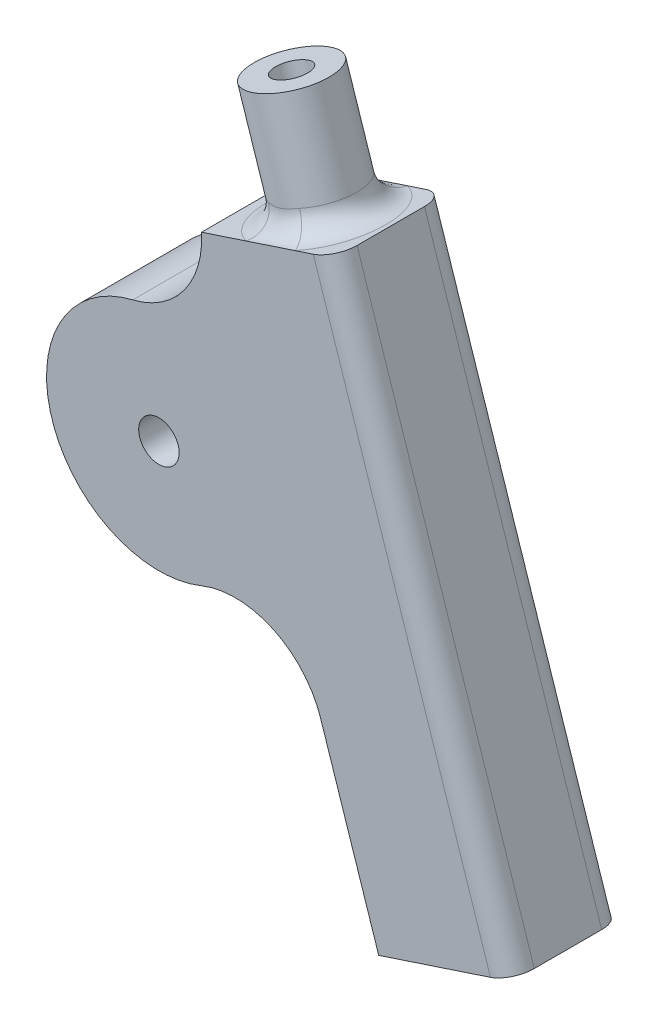
ISO-10303-21;
HEADER;
FILE_DESCRIPTION(('STEP AP214'),'2;1');
FILE_NAME('part.step','',(''),(''),'','','');
FILE_SCHEMA(('AUTOMOTIVE_DESIGN { 1 0 10303 214 1 1 1 1 }'));
ENDSEC;
DATA;
#1=APPLICATION_CONTEXT('core data for automotive mechanical design processes');
#2=APPLICATION_PROTOCOL_DEFINITION('international standard','automotive_design',2000,#1);
#3=PRODUCT_CONTEXT('',#1,'mechanical');
#4=PRODUCT('Part','Part','',(#3));
#5=PRODUCT_RELATED_PRODUCT_CATEGORY('part','',(#4));
#6=PRODUCT_DEFINITION_FORMATION('','',#4);
#7=PRODUCT_DEFINITION_CONTEXT('part definition',#1,'design');
#8=PRODUCT_DEFINITION('design','',#6,#7);
#9=PRODUCT_DEFINITION_SHAPE('','',#8);
#10=(LENGTH_UNIT() NAMED_UNIT(*) SI_UNIT(.MILLI.,.METRE.));
#11=(NAMED_UNIT(*) PLANE_ANGLE_UNIT() SI_UNIT($,.RADIAN.));
#12=(NAMED_UNIT(*) SI_UNIT($,.STERADIAN.) SOLID_ANGLE_UNIT());
#13=UNCERTAINTY_MEASURE_WITH_UNIT(LENGTH_MEASURE(1.E-05),#10,'distance_accuracy_value','');
#14=(GEOMETRIC_REPRESENTATION_CONTEXT(3) GLOBAL_UNCERTAINTY_ASSIGNED_CONTEXT((#13)) GLOBAL_UNIT_ASSIGNED_CONTEXT((#10,
#11,#12)) REPRESENTATION_CONTEXT('',''));
#15=CARTESIAN_POINT('',(0.,0.,0.));
#16=DIRECTION('',(0.,0.,1.));
#17=DIRECTION('',(1.,0.,0.));
#18=AXIS2_PLACEMENT_3D('',#15,#16,#17);
#19=CARTESIAN_POINT('',(1.89625987948407,14.0501920467847,-2.49999999999998));
#20=DIRECTION('',(-0.312988116167319,0.949757042162906,0.));
#21=DIRECTION('',(-0.949757042162906,-0.312988116167319,0.));
#22=AXIS2_PLACEMENT_3D('',#19,#20,#21);
#23=PLANE('',#22);
#24=DIRECTION('',(0.,0.,1.));
#25=VECTOR('',#24,1.);
#26=CARTESIAN_POINT('',(7.81875317482997,16.0019227918418,-2.49999999999998));
#27=LINE('',#26,#25);
#28=CARTESIAN_POINT('',(7.81875317482997,16.0019227918418,-1.50000000000002));
#29=VERTEX_POINT('',#28);
#30=CARTESIAN_POINT('',(7.81875317482997,16.0019227918418,1.50000000000002));
#31=VERTEX_POINT('',#30);
#32=EDGE_CURVE('E172',#29,#31,#27,.T.);
#33=ORIENTED_EDGE('',*,*,#32,.F.);
#34=CARTESIAN_POINT('',(6.86899613266706,15.6889346756745,-1.50000000000002));
#35=DIRECTION('',(-0.312988116167319,0.949757042162906,0.));
#36=DIRECTION('',(-0.949757042162906,-0.312988116167319,0.));
#37=AXIS2_PLACEMENT_3D('',#34,#35,#36);
#38=CIRCLE('',#37,1.);
#39=CARTESIAN_POINT('',(6.86899613266706,15.6889346756745,-2.49999999999998));
#40=VERTEX_POINT('',#39);
#41=EDGE_CURVE('E375',#29,#40,#38,.T.);
#42=ORIENTED_EDGE('',*,*,#41,.T.);
#43=DIRECTION('',(-0.949757042162906,-0.312988116167319,0.));
#44=VECTOR('',#43,1.);
#45=CARTESIAN_POINT('',(1.89625987948407,14.0501920467847,-2.49999999999998));
#46=LINE('',#45,#44);
#47=CARTESIAN_POINT('',(6.05766944729259,15.4215656543579,-2.49999999999998));
#48=VERTEX_POINT('',#47);
#49=EDGE_CURVE('E168',#40,#48,#46,.T.);
#50=ORIENTED_EDGE('',*,*,#49,.T.);
#51=CARTESIAN_POINT('',(4.96958606291033,15.0629927208683,0.));
#52=DIRECTION('',(-0.312988116167319,0.949757042162906,0.));
#53=DIRECTION('',(-0.949757042162906,-0.312988116167319,0.));
#54=AXIS2_PLACEMENT_3D('',#51,#52,#53);
#55=CIRCLE('',#54,2.75);
#56=CARTESIAN_POINT('',(6.05766944729252,15.4215656543579,2.50000000000002));
#57=VERTEX_POINT('',#56);
#58=EDGE_CURVE('E341',#48,#57,#55,.F.);
#59=ORIENTED_EDGE('',*,*,#58,.T.);
#60=DIRECTION('',(-0.949757042162906,-0.312988116167319,0.));
#61=VECTOR('',#60,1.);
#62=CARTESIAN_POINT('',(1.89625987948407,14.0501920467847,2.50000000000002));
#63=LINE('',#62,#61);
#64=CARTESIAN_POINT('',(6.86899613266706,15.6889346756745,2.50000000000002));
#65=VERTEX_POINT('',#64);
#66=EDGE_CURVE('E154',#65,#57,#63,.T.);
#67=ORIENTED_EDGE('',*,*,#66,.F.);
#68=CARTESIAN_POINT('',(6.86899613266706,15.6889346756745,1.50000000000002));
#69=DIRECTION('',(-0.312988116167319,0.949757042162906,0.));
#70=DIRECTION('',(-0.949757042162906,-0.312988116167319,0.));
#71=AXIS2_PLACEMENT_3D('',#68,#69,#70);
#72=CIRCLE('',#71,1.);
#73=EDGE_CURVE('E377',#65,#31,#72,.T.);
#74=ORIENTED_EDGE('',*,*,#73,.T.);
#75=EDGE_LOOP('',(#33,#42,#50,#59,#67,#74));
#76=FACE_BOUND('',#75,.T.);
#77=ADVANCED_FACE('F38',(#76),#23,.T.);
#78=CARTESIAN_POINT('',(3.88150267852815,14.7044197873788,2.50000000000002));
#79=VERTEX_POINT('',#78);
#80=CARTESIAN_POINT('',(1.89625987948407,14.0501920467847,2.50000000000002));
#81=VERTEX_POINT('',#80);
#82=EDGE_CURVE('E167',#79,#81,#63,.T.);
#83=ORIENTED_EDGE('',*,*,#82,.F.);
#84=CARTESIAN_POINT('',(4.96958606291033,15.0629927208683,0.));
#85=DIRECTION('',(-0.312988116167319,0.949757042162906,0.));
#86=DIRECTION('',(-0.949757042162906,-0.312988116167319,0.));
#87=AXIS2_PLACEMENT_3D('',#84,#85,#86);
#88=CIRCLE('',#87,2.75);
#89=CARTESIAN_POINT('',(3.88150267852808,14.7044197873787,-2.49999999999998));
#90=VERTEX_POINT('',#89);
#91=EDGE_CURVE('E328',#79,#90,#88,.F.);
#92=ORIENTED_EDGE('',*,*,#91,.T.);
#93=CARTESIAN_POINT('',(1.89625987948407,14.0501920467847,-2.49999999999998));
#94=VERTEX_POINT('',#93);
#95=EDGE_CURVE('E153',#90,#94,#46,.T.);
#96=ORIENTED_EDGE('',*,*,#95,.T.);
#97=DIRECTION('',(0.,0.,1.));
#98=VECTOR('',#97,1.);
#99=CARTESIAN_POINT('',(1.89625987948407,14.0501920467847,-2.49999999999998));
#100=LINE('',#99,#98);
#101=EDGE_CURVE('E175',#94,#81,#100,.T.);
#102=ORIENTED_EDGE('',*,*,#101,.T.);
#103=EDGE_LOOP('',(#83,#92,#96,#102));
#104=FACE_BOUND('',#103,.T.);
#105=ADVANCED_FACE('F276',(#104),#23,.T.);
#106=CARTESIAN_POINT('',(0.,5.04999999999999,-2.50000000000002));
#107=DIRECTION('',(0.,0.,1.));
#108=DIRECTION('',(1.,0.,0.));
#109=AXIS2_PLACEMENT_3D('',#106,#107,#108);
#110=CYLINDRICAL_SURFACE('',#109,5.);
#111=CARTESIAN_POINT('',(0.,5.04999999999999,2.50000000000002));
#112=DIRECTION('',(0.,0.,1.));
#113=DIRECTION('',(1.,0.,0.));
#114=AXIS2_PLACEMENT_3D('',#111,#112,#113);
#115=CIRCLE('',#114,5.);
#116=CARTESIAN_POINT('',(-1.16448041365872,9.91250813533563,2.50000000000002));
#117=VERTEX_POINT('',#116);
#118=CARTESIAN_POINT('',(1.88729875135673,0.419870042522842,2.50000000000002));
#119=VERTEX_POINT('',#118);
#120=EDGE_CURVE('E184',#117,#119,#115,.T.);
#121=ORIENTED_EDGE('',*,*,#120,.F.);
#122=DIRECTION('',(0.,0.,1.));
#123=VECTOR('',#122,1.);
#124=CARTESIAN_POINT('',(-1.16448041365872,9.91250813533563,-2.50000000000002));
#125=LINE('',#124,#123);
#126=CARTESIAN_POINT('',(-1.16448041365872,9.91250813533563,-2.50000000000002));
#127=VERTEX_POINT('',#126);
#128=EDGE_CURVE('E199',#117,#127,#125,.F.);
#129=ORIENTED_EDGE('',*,*,#128,.T.);
#130=CARTESIAN_POINT('',(0.,5.04999999999999,-2.50000000000002));
#131=DIRECTION('',(0.,0.,1.));
#132=DIRECTION('',(1.,0.,0.));
#133=AXIS2_PLACEMENT_3D('',#130,#131,#132);
#134=CIRCLE('',#133,5.);
#135=CARTESIAN_POINT('',(1.88729875135673,0.419870042522843,-2.50000000000002));
#136=VERTEX_POINT('',#135);
#137=EDGE_CURVE('E192',#127,#136,#134,.T.);
#138=ORIENTED_EDGE('',*,*,#137,.T.);
#139=DIRECTION('',(0.,0.,1.));
#140=VECTOR('',#139,1.);
#141=CARTESIAN_POINT('',(1.88729875135673,0.419870042522842,-2.50000000000002));
#142=LINE('',#141,#140);
#143=EDGE_CURVE('E197',#136,#119,#142,.T.);
#144=ORIENTED_EDGE('',*,*,#143,.T.);
#145=EDGE_LOOP('',(#121,#129,#138,#144));
#146=FACE_BOUND('',#145,.T.);
#147=ADVANCED_FACE('F281',(#146),#110,.T.);
#148=CARTESIAN_POINT('',(0.,5.04999999999999,-2.50000000000002));
#149=DIRECTION('',(0.,0.,1.));
#150=DIRECTION('',(1.,0.,0.));
#151=AXIS2_PLACEMENT_3D('',#148,#149,#150);
#152=PLANE('',#151);
#153=CARTESIAN_POINT('',(0.,5.04999999999999,-2.50000000000002));
#154=DIRECTION('',(0.,0.,1.));
#155=DIRECTION('',(1.,0.,0.));
#156=AXIS2_PLACEMENT_3D('',#153,#154,#155);
#157=CIRCLE('',#156,2.5);
#158=CARTESIAN_POINT('',(2.5,5.04999999999999,-2.50000000000002));
#159=VERTEX_POINT('',#158);
#160=EDGE_CURVE('E189',#159,#159,#157,.T.);
#161=ORIENTED_EDGE('',*,*,#160,.T.);
#162=EDGE_LOOP('',(#161));
#163=FACE_BOUND('',#162,.T.);
#164=ORIENTED_EDGE('',*,*,#49,.F.);
#165=DIRECTION('',(-0.312988116167319,0.949757042162906,0.));
#166=VECTOR('',#165,1.);
#167=CARTESIAN_POINT('',(14.7543169252602,-8.23893531564275,-2.50000000000002));
#168=LINE('',#167,#166);
#169=CARTESIAN_POINT('',(14.7543169252602,-8.23893531564275,-2.49999999999998));
#170=VERTEX_POINT('',#169);
#171=EDGE_CURVE('E61',#40,#170,#168,.F.);
#172=ORIENTED_EDGE('',*,*,#171,.T.);
#173=DIRECTION('',(0.949757042162906,0.312988116167319,0.));
#174=VECTOR('',#173,1.);
#175=CARTESIAN_POINT('',(15.7040739674231,-7.92594719947543,-2.49999999999998));
#176=LINE('',#175,#174);
#177=CARTESIAN_POINT('',(9.78158067207722,-9.87767794453259,-2.49999999999998));
#178=VERTEX_POINT('',#177);
#179=EDGE_CURVE('E159',#178,#170,#176,.T.);
#180=ORIENTED_EDGE('',*,*,#179,.F.);
#181=DIRECTION('',(0.31298811616732,-0.949757042162906,0.));
#182=VECTOR('',#181,1.);
#183=CARTESIAN_POINT('',(9.4685925559099,-8.92792090236969,-2.49999999999998));
#184=LINE('',#183,#182);
#185=CARTESIAN_POINT('',(7.19616592109374,-2.0322814587896,-2.49999999999998));
#186=VERTEX_POINT('',#185);
#187=EDGE_CURVE('E158',#186,#178,#184,.T.);
#188=ORIENTED_EDGE('',*,*,#187,.F.);
#189=CARTESIAN_POINT('',(3.39713775244212,-3.28423392345888,-2.50000000000002));
#190=DIRECTION('',(0.,0.,1.));
#191=DIRECTION('',(1.,0.,0.));
#192=AXIS2_PLACEMENT_3D('',#189,#190,#191);
#193=CIRCLE('',#192,4.);
#194=EDGE_CURVE('E208',#186,#136,#193,.T.);
#195=ORIENTED_EDGE('',*,*,#194,.T.);
#196=ORIENTED_EDGE('',*,*,#137,.F.);
#197=CARTESIAN_POINT('',(-2.09606474458569,13.8025146436041,-2.50000000000002));
#198=DIRECTION('',(0.,0.,1.));
#199=DIRECTION('',(1.,0.,0.));
#200=AXIS2_PLACEMENT_3D('',#197,#198,#199);
#201=CIRCLE('',#200,4.);
#202=EDGE_CURVE('E205',#127,#94,#201,.T.);
#203=ORIENTED_EDGE('',*,*,#202,.T.);
#204=ORIENTED_EDGE('',*,*,#95,.F.);
#205=EDGE_CURVE('E170',#48,#90,#46,.T.);
#206=ORIENTED_EDGE('',*,*,#205,.F.);
#207=EDGE_LOOP('',(#164,#172,#180,#188,#195,#196,#203,#204,#206));
#208=FACE_BOUND('',#207,.T.);
#209=ADVANCED_FACE('F300',(#163,#208),#152,.F.);
#210=CARTESIAN_POINT('',(0.,5.04999999999999,-2.50000000000002));
#211=DIRECTION('',(0.,0.,1.));
#212=DIRECTION('',(1.,0.,0.));
#213=AXIS2_PLACEMENT_3D('',#210,#211,#212);
#214=CYLINDRICAL_SURFACE('',#213,2.5);
#215=ORIENTED_EDGE('',*,*,#160,.F.);
#216=EDGE_LOOP('',(#215));
#217=FACE_BOUND('',#216,.T.);
#218=CARTESIAN_POINT('',(0.,5.04999999999999,0.));
#219=DIRECTION('',(0.,0.,1.));
#220=DIRECTION('',(1.,0.,0.));
#221=AXIS2_PLACEMENT_3D('',#218,#219,#220);
#222=CIRCLE('',#221,2.5);
#223=CARTESIAN_POINT('',(2.5,5.04999999999999,0.));
#224=VERTEX_POINT('',#223);
#225=EDGE_CURVE('E188',#224,#224,#222,.T.);
#226=ORIENTED_EDGE('',*,*,#225,.T.);
#227=EDGE_LOOP('',(#226));
#228=FACE_BOUND('',#227,.T.);
#229=ADVANCED_FACE('F447',(#217,#228),#214,.F.);
#230=CARTESIAN_POINT('',(0.,5.04999999999999,0.));
#231=DIRECTION('',(0.,0.,1.));
#232=DIRECTION('',(1.,0.,0.));
#233=AXIS2_PLACEMENT_3D('',#230,#231,#232);
#234=PLANE('',#233);
#235=CARTESIAN_POINT('',(0.,5.04999999999999,0.));
#236=DIRECTION('',(0.,0.,1.));
#237=DIRECTION('',(1.,0.,0.));
#238=AXIS2_PLACEMENT_3D('',#235,#236,#237);
#239=CIRCLE('',#238,0.9);
#240=CARTESIAN_POINT('',(0.9,5.04999999999999,0.));
#241=VERTEX_POINT('',#240);
#242=EDGE_CURVE('E178',#241,#241,#239,.T.);
#243=ORIENTED_EDGE('',*,*,#242,.T.);
#244=EDGE_LOOP('',(#243));
#245=FACE_BOUND('',#244,.T.);
#246=ORIENTED_EDGE('',*,*,#225,.F.);
#247=EDGE_LOOP('',(#246));
#248=FACE_BOUND('',#247,.T.);
#249=ADVANCED_FACE('F461',(#245,#248),#234,.F.);
#250=CARTESIAN_POINT('',(0.,5.04999999999999,2.50000000000002));
#251=DIRECTION('',(0.,0.,1.));
#252=DIRECTION('',(1.,0.,0.));
#253=AXIS2_PLACEMENT_3D('',#250,#251,#252);
#254=PLANE('',#253);
#255=DIRECTION('',(-0.949757042162906,-0.312988116167319,0.));
#256=VECTOR('',#255,1.);
#257=CARTESIAN_POINT('',(15.7040739674231,-7.92594719947543,2.50000000000002));
#258=LINE('',#257,#256);
#259=CARTESIAN_POINT('',(14.7543169252602,-8.23893531564275,2.50000000000002));
#260=VERTEX_POINT('',#259);
#261=CARTESIAN_POINT('',(9.78158067207722,-9.87767794453259,2.50000000000002));
#262=VERTEX_POINT('',#261);
#263=EDGE_CURVE('E134',#260,#262,#258,.T.);
#264=ORIENTED_EDGE('',*,*,#263,.F.);
#265=DIRECTION('',(-0.312988116167319,0.949757042162906,0.));
#266=VECTOR('',#265,1.);
#267=CARTESIAN_POINT('',(9.35865665040129,8.13410275979131,2.50000000000002));
#268=LINE('',#267,#266);
#269=EDGE_CURVE('E11',#260,#65,#268,.T.);
#270=ORIENTED_EDGE('',*,*,#269,.T.);
#271=ORIENTED_EDGE('',*,*,#66,.T.);
#272=EDGE_CURVE('E173',#57,#79,#63,.T.);
#273=ORIENTED_EDGE('',*,*,#272,.T.);
#274=ORIENTED_EDGE('',*,*,#82,.T.);
#275=CARTESIAN_POINT('',(-2.09606474458569,13.8025146436041,2.50000000000002));
#276=DIRECTION('',(0.,0.,1.));
#277=DIRECTION('',(1.,0.,0.));
#278=AXIS2_PLACEMENT_3D('',#275,#276,#277);
#279=CIRCLE('',#278,4.);
#280=EDGE_CURVE('E203',#81,#117,#279,.F.);
#281=ORIENTED_EDGE('',*,*,#280,.T.);
#282=ORIENTED_EDGE('',*,*,#120,.T.);
#283=CARTESIAN_POINT('',(3.39713775244212,-3.28423392345888,2.50000000000002));
#284=DIRECTION('',(0.,0.,1.));
#285=DIRECTION('',(1.,0.,0.));
#286=AXIS2_PLACEMENT_3D('',#283,#284,#285);
#287=CIRCLE('',#286,4.);
#288=CARTESIAN_POINT('',(7.19616592109374,-2.0322814587896,2.50000000000002));
#289=VERTEX_POINT('',#288);
#290=EDGE_CURVE('E149',#119,#289,#287,.F.);
#291=ORIENTED_EDGE('',*,*,#290,.T.);
#292=DIRECTION('',(0.31298811616732,-0.949757042162906,0.));
#293=VECTOR('',#292,1.);
#294=CARTESIAN_POINT('',(9.4685925559099,-8.92792090236969,2.50000000000002));
#295=LINE('',#294,#293);
#296=EDGE_CURVE('E144',#289,#262,#295,.T.);
#297=ORIENTED_EDGE('',*,*,#296,.T.);
#298=EDGE_LOOP('',(#264,#270,#271,#273,#274,#281,#282,#291,#297));
#299=FACE_BOUND('',#298,.T.);
#300=CARTESIAN_POINT('',(0.,5.04999999999999,2.50000000000002));
#301=DIRECTION('',(0.,0.,1.));
#302=DIRECTION('',(1.,0.,0.));
#303=AXIS2_PLACEMENT_3D('',#300,#301,#302);
#304=CIRCLE('',#303,0.9);
#305=CARTESIAN_POINT('',(0.9,5.04999999999999,2.50000000000002));
#306=VERTEX_POINT('',#305);
#307=EDGE_CURVE('E181',#306,#306,#304,.T.);
#308=ORIENTED_EDGE('',*,*,#307,.F.);
#309=EDGE_LOOP('',(#308));
#310=FACE_BOUND('',#309,.T.);
#311=ADVANCED_FACE('F145',(#299,#310),#254,.T.);
#312=CARTESIAN_POINT('',(0.,5.04999999999999,2.50000000000002));
#313=DIRECTION('',(0.,0.,-1.));
#314=DIRECTION('',(-1.,0.,0.));
#315=AXIS2_PLACEMENT_3D('',#312,#313,#314);
#316=CYLINDRICAL_SURFACE('',#315,0.9);
#317=ORIENTED_EDGE('',*,*,#307,.T.);
#318=EDGE_LOOP('',(#317));
#319=FACE_BOUND('',#318,.T.);
#320=ORIENTED_EDGE('',*,*,#242,.F.);
#321=EDGE_LOOP('',(#320));
#322=FACE_BOUND('',#321,.T.);
#323=ADVANCED_FACE('F460',(#319,#322),#316,.F.);
#324=CARTESIAN_POINT('',(9.4685925559099,-8.92792090236969,-2.49999999999998));
#325=DIRECTION('',(-0.949757042162906,-0.31298811616732,0.));
#326=DIRECTION('',(0.31298811616732,-0.949757042162906,0.));
#327=AXIS2_PLACEMENT_3D('',#324,#325,#326);
#328=PLANE('',#327);
#329=ORIENTED_EDGE('',*,*,#296,.F.);
#330=DIRECTION('',(0.,0.,-1.));
#331=VECTOR('',#330,1.);
#332=CARTESIAN_POINT('',(7.19616592109374,-2.0322814587896,-2.49999999999998));
#333=LINE('',#332,#331);
#334=EDGE_CURVE('E201',#289,#186,#333,.T.);
#335=ORIENTED_EDGE('',*,*,#334,.T.);
#336=ORIENTED_EDGE('',*,*,#187,.T.);
#337=DIRECTION('',(0.,0.,-1.));
#338=VECTOR('',#337,1.);
#339=CARTESIAN_POINT('',(9.78158067207722,-9.87767794453259,2.50000000000002));
#340=LINE('',#339,#338);
#341=EDGE_CURVE('E138',#262,#178,#340,.T.);
#342=ORIENTED_EDGE('',*,*,#341,.F.);
#343=EDGE_LOOP('',(#329,#335,#336,#342));
#344=FACE_BOUND('',#343,.T.);
#345=ADVANCED_FACE('F156',(#344),#328,.T.);
#346=CARTESIAN_POINT('',(7.81875317482997,16.0019227918418,-2.49999999999998));
#347=DIRECTION('',(0.949757042162906,0.312988116167319,0.));
#348=DIRECTION('',(-0.312988116167319,0.949757042162906,0.));
#349=AXIS2_PLACEMENT_3D('',#346,#347,#348);
#350=PLANE('',#349);
#351=DIRECTION('',(0.,0.,1.));
#352=VECTOR('',#351,1.);
#353=CARTESIAN_POINT('',(15.7040739674231,-7.92594719947543,2.50000000000002));
#354=LINE('',#353,#352);
#355=CARTESIAN_POINT('',(15.7040739674231,-7.92594719947543,-1.50000000000002));
#356=VERTEX_POINT('',#355);
#357=CARTESIAN_POINT('',(15.7040739674231,-7.92594719947543,1.50000000000002));
#358=VERTEX_POINT('',#357);
#359=EDGE_CURVE('E141',#356,#358,#354,.T.);
#360=ORIENTED_EDGE('',*,*,#359,.F.);
#361=DIRECTION('',(-0.312988116167319,0.949757042162906,0.));
#362=VECTOR('',#361,1.);
#363=CARTESIAN_POINT('',(7.81875317482997,16.0019227918418,-1.50000000000002));
#364=LINE('',#363,#362);
#365=EDGE_CURVE('E371',#356,#29,#364,.T.);
#366=ORIENTED_EDGE('',*,*,#365,.T.);
#367=ORIENTED_EDGE('',*,*,#32,.T.);
#368=DIRECTION('',(-0.312988116167319,0.949757042162906,0.));
#369=VECTOR('',#368,1.);
#370=CARTESIAN_POINT('',(7.81875317482997,16.0019227918418,1.50000000000002));
#371=LINE('',#370,#369);
#372=EDGE_CURVE('E259',#31,#358,#371,.F.);
#373=ORIENTED_EDGE('',*,*,#372,.T.);
#374=EDGE_LOOP('',(#360,#366,#367,#373));
#375=FACE_BOUND('',#374,.T.);
#376=ADVANCED_FACE('F288',(#375),#350,.T.);
#377=CARTESIAN_POINT('',(-2.09606474458569,13.8025146436041,-2.50000000000002));
#378=DIRECTION('',(0.,0.,-1.));
#379=DIRECTION('',(-1.,0.,0.));
#380=AXIS2_PLACEMENT_3D('',#377,#378,#379);
#381=CYLINDRICAL_SURFACE('',#380,4.);
#382=ORIENTED_EDGE('',*,*,#202,.F.);
#383=ORIENTED_EDGE('',*,*,#128,.F.);
#384=ORIENTED_EDGE('',*,*,#280,.F.);
#385=ORIENTED_EDGE('',*,*,#101,.F.);
#386=EDGE_LOOP('',(#382,#383,#384,#385));
#387=FACE_BOUND('',#386,.T.);
#388=ADVANCED_FACE('F363',(#387),#381,.F.);
#389=CARTESIAN_POINT('',(3.39713775244212,-3.28423392345888,-2.50000000000002));
#390=DIRECTION('',(0.,0.,1.));
#391=DIRECTION('',(1.,0.,0.));
#392=AXIS2_PLACEMENT_3D('',#389,#390,#391);
#393=CYLINDRICAL_SURFACE('',#392,4.);
#394=ORIENTED_EDGE('',*,*,#290,.F.);
#395=ORIENTED_EDGE('',*,*,#143,.F.);
#396=ORIENTED_EDGE('',*,*,#194,.F.);
#397=ORIENTED_EDGE('',*,*,#334,.F.);
#398=EDGE_LOOP('',(#394,#395,#396,#397));
#399=FACE_BOUND('',#398,.T.);
#400=ADVANCED_FACE('F231',(#399),#393,.F.);
#401=CARTESIAN_POINT('',(3.89448380427069,-11.817743957787,0.));
#402=DIRECTION('',(-0.312988116167319,0.949757042162906,0.));
#403=DIRECTION('',(-0.949757042162906,-0.312988116167319,0.));
#404=AXIS2_PLACEMENT_3D('',#401,#402,#403);
#405=PLANE('',#404);
#406=ORIENTED_EDGE('',*,*,#179,.T.);
#407=CARTESIAN_POINT('',(14.7543169252602,-8.23893531564275,-1.50000000000002));
#408=DIRECTION('',(-0.312988116167319,0.949757042162906,0.));
#409=DIRECTION('',(-0.949757042162906,-0.312988116167319,0.));
#410=AXIS2_PLACEMENT_3D('',#407,#408,#409);
#411=CIRCLE('',#410,1.);
#412=EDGE_CURVE('E46',#170,#356,#411,.F.);
#413=ORIENTED_EDGE('',*,*,#412,.T.);
#414=ORIENTED_EDGE('',*,*,#359,.T.);
#415=CARTESIAN_POINT('',(14.7543169252602,-8.23893531564275,1.50000000000002));
#416=DIRECTION('',(-0.312988116167319,0.949757042162906,0.));
#417=DIRECTION('',(-0.949757042162906,-0.312988116167319,0.));
#418=AXIS2_PLACEMENT_3D('',#415,#416,#417);
#419=CIRCLE('',#418,1.);
#420=EDGE_CURVE('E53',#358,#260,#419,.F.);
#421=ORIENTED_EDGE('',*,*,#420,.T.);
#422=ORIENTED_EDGE('',*,*,#263,.T.);
#423=ORIENTED_EDGE('',*,*,#341,.T.);
#424=EDGE_LOOP('',(#406,#413,#414,#421,#422,#423));
#425=FACE_BOUND('',#424,.T.);
#426=ADVANCED_FACE('F136',(#425),#405,.F.);
#427=CARTESIAN_POINT('',(3.40464548207374,19.8117779316829,0.));
#428=DIRECTION('',(-0.312988116167319,0.949757042162906,0.));
#429=DIRECTION('',(-0.949757042162906,-0.312988116167319,0.));
#430=AXIS2_PLACEMENT_3D('',#427,#428,#429);
#431=PLANE('',#430);
#432=CARTESIAN_POINT('',(3.40464548207374,19.8117779316829,0.));
#433=DIRECTION('',(-0.312988116167319,0.949757042162906,0.));
#434=DIRECTION('',(-0.949757042162906,-0.312988116167319,0.));
#435=AXIS2_PLACEMENT_3D('',#432,#433,#434);
#436=CIRCLE('',#435,1.75);
#437=CARTESIAN_POINT('',(1.74257065828865,19.2640487283901,0.));
#438=VERTEX_POINT('',#437);
#439=EDGE_CURVE('E380',#438,#438,#436,.T.);
#440=ORIENTED_EDGE('',*,*,#439,.T.);
#441=EDGE_LOOP('',(#440));
#442=FACE_BOUND('',#441,.T.);
#443=CARTESIAN_POINT('',(3.40464548207374,19.8117779316829,0.));
#444=DIRECTION('',(-0.312988116167319,0.949757042162906,0.));
#445=DIRECTION('',(-0.949757042162906,-0.312988116167319,0.));
#446=AXIS2_PLACEMENT_3D('',#443,#444,#445);
#447=CIRCLE('',#446,0.749999999999999);
#448=CARTESIAN_POINT('',(2.69232770045156,19.5770368445574,0.));
#449=VERTEX_POINT('',#448);
#450=EDGE_CURVE('E333',#449,#449,#447,.T.);
#451=ORIENTED_EDGE('',*,*,#450,.F.);
#452=EDGE_LOOP('',(#451));
#453=FACE_BOUND('',#452,.T.);
#454=ADVANCED_FACE('F388',(#442,#453),#431,.T.);
#455=CARTESIAN_POINT('',(3.40464548207374,19.8117779316829,0.));
#456=DIRECTION('',(0.312988116167319,-0.949757042162906,0.));
#457=DIRECTION('',(0.949757042162906,0.312988116167319,0.));
#458=AXIS2_PLACEMENT_3D('',#455,#456,#457);
#459=CYLINDRICAL_SURFACE('',#458,1.75);
#460=CARTESIAN_POINT('',(4.65659794674302,16.0127497630312,0.));
#461=DIRECTION('',(-0.312988116167319,0.949757042162906,0.));
#462=DIRECTION('',(-0.949757042162906,-0.312988116167319,0.));
#463=AXIS2_PLACEMENT_3D('',#460,#461,#462);
#464=CIRCLE('',#463,1.75);
#465=CARTESIAN_POINT('',(5.34901464589531,16.2409325388882,1.5909090909091));
#466=VERTEX_POINT('',#465);
#467=CARTESIAN_POINT('',(5.34901464589536,16.2409325388883,-1.59090909090908));
#468=VERTEX_POINT('',#467);
#469=EDGE_CURVE('E211',#466,#468,#464,.T.);
#470=ORIENTED_EDGE('',*,*,#469,.T.);
#471=CARTESIAN_POINT('',(5.53068071290451,16.2877365470845,-1.49097804050181));
#472=CARTESIAN_POINT('',(5.81072435006214,15.1795764750921,-1.54067264024666));
#473=CARTESIAN_POINT('',(6.33704251277546,15.5136317782102,-2.49999999999998));
#474=CARTESIAN_POINT('',(5.49431717377668,16.281610358217,-1.51338892588172));
#475=CARTESIAN_POINT('',(5.78687536548597,15.209161930245,-1.54635339125543));
#476=CARTESIAN_POINT('',(6.28263588841757,15.4957023224559,-2.49999999999998));
#477=CARTESIAN_POINT('',(5.45779026547278,16.2731317379423,-1.53448742261344));
#478=CARTESIAN_POINT('',(5.75860715952737,15.2345774941473,-1.5556656756951));
#479=CARTESIAN_POINT('',(6.22689880571017,15.4773344202001,-2.49999999999998));
#480=CARTESIAN_POINT('',(5.38434789539898,16.2527148317772,-1.57388827992488));
#481=CARTESIAN_POINT('',(5.69594617597004,15.2763539929652,-1.5780919378642));
#482=CARTESIAN_POINT('',(6.11325776665026,15.4398845323281,-2.49999999999998));
#483=CARTESIAN_POINT('',(5.3474329954644,16.2407810216445,-1.59219421137058));
#484=CARTESIAN_POINT('',(5.66164165852996,15.2930337730363,-1.59112805124301));
#485=CARTESIAN_POINT('',(6.05535669744064,15.4208034981567,-2.49999999999998));
#486=CARTESIAN_POINT('',(5.27307242923196,16.2146812804089,-1.62589131555994));
#487=CARTESIAN_POINT('',(5.58855609182722,15.3181466491781,-1.61804826707775));
#488=CARTESIAN_POINT('',(5.93775951947314,15.3820498826902,-2.49999999999998));
#489=CARTESIAN_POINT('',(5.23562695045891,16.2005161208751,-1.64128349180323));
#490=CARTESIAN_POINT('',(5.54975605937108,15.3268189397983,-1.63195840591286));
#491=CARTESIAN_POINT('',(5.87806403695043,15.3623775077679,-2.49999999999998));
#492=CARTESIAN_POINT('',(5.16007608722264,16.1709484170406,-1.66909279027932));
#493=CARTESIAN_POINT('',(5.46898726068337,15.3372703199495,-1.65871577822525));
#494=CARTESIAN_POINT('',(5.75715964696884,15.3225340156149,-2.49999999999998));
#495=CARTESIAN_POINT('',(5.12197047052963,16.1555454300544,-1.68150884177793));
#496=CARTESIAN_POINT('',(5.42692580802675,15.3391993754522,-1.67163362940814));
#497=CARTESIAN_POINT('',(5.69595020353631,15.3023627217564,-2.49999999999998));
#498=CARTESIAN_POINT('',(5.04325554024145,16.1236455780027,-1.70380522141641));
#499=CARTESIAN_POINT('',(5.33874115875291,15.3373584242766,-1.69564098073699));
#500=CARTESIAN_POINT('',(5.56947137387533,15.2606821983454,-2.49999999999998));
#501=CARTESIAN_POINT('',(5.00261212026148,16.1071311272268,-1.71354107049782));
#502=CARTESIAN_POINT('',(5.29233005849062,15.3334096792771,-1.70671858886127));
#503=CARTESIAN_POINT('',(5.50414542746145,15.2391543296409,-2.49999999999998));
#504=CARTESIAN_POINT('',(4.92052890168617,16.0744970292927,-1.72962714600421));
#505=CARTESIAN_POINT('',(5.19830491113806,15.320569388849,-1.72534021323588));
#506=CARTESIAN_POINT('',(5.3725491001743,15.1957873581485,-2.49999999999998));
#507=CARTESIAN_POINT('',(4.87908912034566,16.0583773735975,-1.73597744569871));
#508=CARTESIAN_POINT('',(5.15049071669642,15.311703268527,-1.73296551181014));
#509=CARTESIAN_POINT('',(5.30627873977175,15.1739482621068,-2.49999999999998));
#510=CARTESIAN_POINT('',(4.79549864977968,16.0271174365867,-1.74525036952243));
#511=CARTESIAN_POINT('',(5.05469912268637,15.2900107917955,-1.74414758796381));
#512=CARTESIAN_POINT('',(5.17318780714064,15.130088750217,-2.49999999999998));
#513=CARTESIAN_POINT('',(4.75334808877934,16.0119769809559,-1.74817360532583));
#514=CARTESIAN_POINT('',(5.00649971049265,15.2771597439075,-1.74775693759292));
#515=CARTESIAN_POINT('',(5.10636733524251,15.1080683674323,-2.49999999999998));
#516=CARTESIAN_POINT('',(4.6685289105452,15.9830043711878,-1.75057276335008));
#517=CARTESIAN_POINT('',(4.91101137738606,15.2481756910567,-1.75070139877802));
#518=CARTESIAN_POINT('',(4.9726031954621,15.0639870031865,-2.49999999999998));
#519=CARTESIAN_POINT('',(4.62586047669668,15.9691717683452,-1.75004987227238));
#520=CARTESIAN_POINT('',(4.86349512179349,15.231980757086,-1.75005196304727));
#521=CARTESIAN_POINT('',(4.90565957792403,15.041926038316,-2.49999999999998));
#522=CARTESIAN_POINT('',(4.53681976242549,15.9417947411544,-1.74538190042725));
#523=CARTESIAN_POINT('',(4.76672864210289,15.1952341367145,-1.74433881970959));
#524=CARTESIAN_POINT('',(4.7666567971306,14.9961183037364,-2.49999999999998));
#525=CARTESIAN_POINT('',(4.49042618567386,15.9283634406164,-1.74094821880825));
#526=CARTESIAN_POINT('',(4.71740032452323,15.1743283159114,-1.7388921858499));
#527=CARTESIAN_POINT('',(4.69462028975538,14.9723790001695,-2.49999999999998));
#528=CARTESIAN_POINT('',(4.39780493722224,15.9027644426079,-1.72809874685785));
#529=CARTESIAN_POINT('',(4.62268848815577,15.1291706443748,-1.72359182030685));
#530=CARTESIAN_POINT('',(4.55137270675849,14.9251724103183,-2.49999999999998));
#531=CARTESIAN_POINT('',(4.35157728989159,15.8905969239575,-1.71968239392791));
#532=CARTESIAN_POINT('',(4.57708110483856,15.1047645450353,-1.71365607085883));
#533=CARTESIAN_POINT('',(4.48016174921181,14.901705162945,-2.49999999999998));
#534=CARTESIAN_POINT('',(4.25986098093582,15.8668735708459,-1.6989307945091));
#535=CARTESIAN_POINT('',(4.49157805628622,15.0523502506612,-1.69031498985419));
#536=CARTESIAN_POINT('',(4.33907307243949,14.8552100308268,-2.49999999999998));
#537=CARTESIAN_POINT('',(4.21437193343144,15.8553174093567,-1.68659766842678));
#538=CARTESIAN_POINT('',(4.45153308209534,15.0241504837394,-1.67679807424518));
#539=CARTESIAN_POINT('',(4.26919465347063,14.8321819154848,-2.49999999999998));
#540=CARTESIAN_POINT('',(4.12473363511269,15.8318608733244,-1.65809322782847));
#541=CARTESIAN_POINT('',(4.37905325372225,14.9637161818678,-1.64781273619213));
#542=CARTESIAN_POINT('',(4.13117617134205,14.7866985520561,-2.49999999999998));
#543=CARTESIAN_POINT('',(4.08058469950829,15.8199604190656,-1.64192101808533));
#544=CARTESIAN_POINT('',(4.34659037407736,14.9312436612369,-1.63222983339161));
#545=CARTESIAN_POINT('',(4.06303651775167,14.764243438941,-2.49999999999998));
#546=CARTESIAN_POINT('',(3.97374258415016,15.7885993802242,-1.59720507287951));
#547=CARTESIAN_POINT('',(4.27806862045239,14.8446876501917,-1.59378177804791));
#548=CARTESIAN_POINT('',(3.89693940756174,14.7095068912648,-2.49999999999998));
#549=CARTESIAN_POINT('',(3.91222831877794,15.7682369940647,-1.56643709749818));
#550=CARTESIAN_POINT('',(4.24864038448523,14.7876614286608,-1.57114612375882));
#551=CARTESIAN_POINT('',(3.80023179319411,14.67763733653,-2.49999999999998));
#552=CARTESIAN_POINT('',(3.82545523201119,15.731645413554,-1.51459994299388));
#553=CARTESIAN_POINT('',(4.22661603734612,14.6970121969208,-1.54734781346923));
#554=CARTESIAN_POINT('',(3.66013898228053,14.631470387479,-2.49999999999998));
#555=CARTESIAN_POINT('',(3.79741769157542,15.7184211984872,-1.496348671524));
#556=CARTESIAN_POINT('',(4.22308591400471,14.6651744271634,-1.54105905421621));
#557=CARTESIAN_POINT('',(3.61421868924081,14.6163375636363,-2.49999999999998));
#558=CARTESIAN_POINT('',(3.74361864835924,15.689192203402,-1.45808911298797));
#559=CARTESIAN_POINT('',(4.22410920146501,14.6002844849772,-1.53423532237318));
#560=CARTESIAN_POINT('',(3.52430548435449,14.5867070756624,-2.49999999999998));
#561=CARTESIAN_POINT('',(3.71786134180914,15.6731824514167,-1.4380777163654));
#562=CARTESIAN_POINT('',(4.22890801909339,14.5671554873491,-1.53387036674347));
#563=CARTESIAN_POINT('',(3.48031619807789,14.5722106063213,-2.49999999999998));
#564=CARTESIAN_POINT('',(3.69350193482884,15.6554194436594,-1.41728631945132));
#565=CARTESIAN_POINT('',(4.23804413641581,14.5346048573389,-1.53779699050384));
#566=CARTESIAN_POINT('',(3.43748942584727,14.5580972381998,-2.49999999999998));
#567=(BOUNDED_SURFACE() B_SPLINE_SURFACE(3,2,((#471,#472,#473),(#474,#475,#476),(#477,#478,
#479),(#480,#481,#482),(#483,#484,#485),(#486,#487,#488),(#489,#490,#491),(#492,#493,#494),
(#495,#496,#497),(#498,#499,#500),(#501,#502,#503),(#504,#505,#506),(#507,#508,#509),(#510,#511,
#512),(#513,#514,#515),(#516,#517,#518),(#519,#520,#521),(#522,#523,#524),(#525,#526,#527),
(#528,#529,#530),(#531,#532,#533),(#534,#535,#536),(#537,#538,#539),(#540,#541,#542),(#543,#544,
#545),(#546,#547,#548),(#549,#550,#551),(#552,#553,#554),(#555,#556,#557),(#558,#559,#560),
(#561,#562,#563),(#564,#565,#566)),.UNSPECIFIED.,.F.,.F.,.F.) B_SPLINE_SURFACE_WITH_KNOTS((4,2,
2,2,2,2,2,2,2,2,2,2,2,2,2,4),(3,3),(0.,0.202246936556469,0.40423305125542,0.606149474707258,
0.80813843389616,1.0195046224338,1.23086623643296,1.44219012013655,1.65344123656755,
1.88172213382519,2.11003528803972,2.33822505144377,2.56646807825792,2.90338282061385,
3.07223565353802,3.24139302683457),(0.,1.),
.UNSPECIFIED.) GEOMETRIC_REPRESENTATION_ITEM() RATIONAL_B_SPLINE_SURFACE(((1.,0.658106590866068,
1.),(1.,0.668750339032276,1.),(1.,0.679008112654528,1.),(1.,0.698491029343826,1.),(1.,
0.707717487052795,1.),(1.,0.724902854942446,1.),(1.,0.732862201366544,1.),(1.,0.747365753246522,
1.),(1.,0.753909449305039,1.),(1.,0.765728951322434,1.),(1.,0.770931792985644,1.),(1.,
0.779559813826044,1.),(1.,0.782985031474242,1.),(1.,0.787994704210009,1.),(1.,0.789579487784121,
1.),(1.,0.790879819888645,1.),(1.,0.790596011883602,1.),(1.,0.788067379570933,1.),(1.,
0.785666314405781,1.),(1.,0.778740224305392,1.),(1.,0.774214899294523,1.),(1.,0.763137925770934,
1.),(1.,0.756587373697339,1.),(1.,0.741606746607805,1.),(1.,0.733176233235826,1.),(1.,
0.710197301581835,1.),(1.,0.694647147037731,1.),(1.,0.669362373715106,1.),(1.,0.660596120872086,
1.),(1.,0.642624480993393,1.),(1.,0.633418330457941,1.),(1.,0.624113903587161,1.))) REPRESENTATION_ITEM('') SURFACE());
#568=CARTESIAN_POINT('',(5.53068071290451,16.2877365470845,-1.49097804050181));
#569=CARTESIAN_POINT('',(5.49431717377668,16.281610358217,-1.51338892588172));
#570=CARTESIAN_POINT('',(5.45779026547278,16.2731317379423,-1.53448742261344));
#571=CARTESIAN_POINT('',(5.38434789539898,16.2527148317771,-1.57388827992488));
#572=CARTESIAN_POINT('',(5.3474329954644,16.2407810216445,-1.59219421137058));
#573=CARTESIAN_POINT('',(5.27307242923196,16.2146812804089,-1.62589131555994));
#574=CARTESIAN_POINT('',(5.23562695045891,16.2005161208751,-1.64128349180323));
#575=CARTESIAN_POINT('',(5.16007608722264,16.1709484170406,-1.66909279027932));
#576=CARTESIAN_POINT('',(5.12197047052963,16.1555454300544,-1.68150884177793));
#577=CARTESIAN_POINT('',(5.04325554024145,16.1236455780027,-1.70380522141641));
#578=CARTESIAN_POINT('',(5.00261212026148,16.1071311272268,-1.71354107049782));
#579=CARTESIAN_POINT('',(4.92052890168617,16.0744970292927,-1.72962714600421));
#580=CARTESIAN_POINT('',(4.87908912034566,16.0583773735975,-1.73597744569871));
#581=CARTESIAN_POINT('',(4.79549864977968,16.0271174365867,-1.74525036952243));
#582=CARTESIAN_POINT('',(4.75334808877934,16.0119769809559,-1.74817360532583));
#583=CARTESIAN_POINT('',(4.6685289105452,15.9830043711878,-1.75057276335008));
#584=CARTESIAN_POINT('',(4.62586047669668,15.9691717683452,-1.75004987227238));
#585=CARTESIAN_POINT('',(4.53681976242549,15.9417947411544,-1.74538190042725));
#586=CARTESIAN_POINT('',(4.49042618567386,15.9283634406164,-1.74094821880825));
#587=CARTESIAN_POINT('',(4.39780493722224,15.9027644426079,-1.72809874685785));
#588=CARTESIAN_POINT('',(4.35157728989159,15.8905969239575,-1.71968239392791));
#589=CARTESIAN_POINT('',(4.25986098093582,15.8668735708459,-1.6989307945091));
#590=CARTESIAN_POINT('',(4.21437193343144,15.8553174093567,-1.68659766842678));
#591=CARTESIAN_POINT('',(4.12473363511269,15.8318608733244,-1.65809322782847));
#592=CARTESIAN_POINT('',(4.08058469950829,15.8199604190656,-1.64192101808533));
#593=CARTESIAN_POINT('',(3.97374258415016,15.7885993802242,-1.59720507287951));
#594=CARTESIAN_POINT('',(3.91222831877794,15.7682369940647,-1.56643709749818));
#595=CARTESIAN_POINT('',(3.82545523201119,15.731645413554,-1.51459994299388));
#596=CARTESIAN_POINT('',(3.79741769157542,15.7184211984872,-1.496348671524));
#597=CARTESIAN_POINT('',(3.74361864835924,15.689192203402,-1.45808911298797));
#598=CARTESIAN_POINT('',(3.71786134180914,15.6731824514167,-1.4380777163654));
#599=CARTESIAN_POINT('',(3.69350193482884,15.6554194436594,-1.41728631945132));
#600=B_SPLINE_CURVE_WITH_KNOTS('',3,(#568,#569,#570,#571,#572,#573,#574,#575,#576,#577,#578,
#579,#580,#581,#582,#583,#584,#585,#586,#587,#588,#589,#590,#591,#592,#593,#594,#595,#596,#597,
#598,#599),.UNSPECIFIED.,.F.,.F.,(4,2,2,2,2,2,2,2,2,2,2,2,2,2,2,4),(0.,0.202246936556469,
0.40423305125542,0.606149474707258,0.80813843389616,1.0195046224338,1.23086623643296,
1.44219012013655,1.65344123656755,1.88172213382519,2.11003528803972,2.33822505144377,
2.56646807825792,2.90338282061385,3.07223565353802,3.24139302683457),.UNSPECIFIED.);
#601=CARTESIAN_POINT('',(3.96418124759067,15.7845669871742,-1.59090909090908));
#602=VERTEX_POINT('',#601);
#603=EDGE_CURVE('E344',#468,#602,#600,.T.);
#604=ORIENTED_EDGE('',*,*,#603,.T.);
#605=CARTESIAN_POINT('',(4.65659794674302,16.0127497630312,0.));
#606=DIRECTION('',(-0.312988116167319,0.949757042162906,0.));
#607=DIRECTION('',(-0.949757042162906,-0.312988116167319,0.));
#608=AXIS2_PLACEMENT_3D('',#605,#606,#607);
#609=CIRCLE('',#608,1.75);
#610=CARTESIAN_POINT('',(3.96418124759072,15.7845669871742,1.5909090909091));
#611=VERTEX_POINT('',#610);
#612=EDGE_CURVE('E221',#602,#611,#609,.T.);
#613=ORIENTED_EDGE('',*,*,#612,.T.);
#614=CARTESIAN_POINT('',(3.79028159489423,15.7141959286493,1.49097804050173));
#615=CARTESIAN_POINT('',(4.22393421925666,14.6566570001674,1.54067264024665));
#616=CARTESIAN_POINT('',(3.60212961304501,14.6123536635264,2.50000000000002));
#617=CARTESIAN_POINT('',(3.82316285040722,15.7308890471066,1.51338892588164));
#618=CARTESIAN_POINT('',(4.22552133369218,14.6946248061309,1.54635339125541));
#619=CARTESIAN_POINT('',(3.65653623740289,14.6302831192807,2.50000000000002));
#620=CARTESIAN_POINT('',(3.85757404736752,15.7457877569757,1.53448742261336));
#621=CARTESIAN_POINT('',(4.23314094785345,14.7318670380273,1.55566567569507));
#622=CARTESIAN_POINT('',(3.71227332011027,14.6486510215365,2.50000000000002));
#623=CARTESIAN_POINT('',(3.9287657270048,15.7730343444654,1.5738882799248));
#624=CARTESIAN_POINT('',(4.25868800895182,14.8027120970158,1.57809193786415));
#625=CARTESIAN_POINT('',(3.82591435917016,14.6861009094085,2.50000000000002));
#626=CARTESIAN_POINT('',(3.96554309697162,15.785385486914,1.5921942113705));
#627=CARTESIAN_POINT('',(4.27635492641317,14.8365188272249,1.59112805124296));
#628=CARTESIAN_POINT('',(3.88381542837977,14.7051819435799,2.50000000000002));
#629=CARTESIAN_POINT('',(4.04085166633317,15.8086085289991,1.62589131555987));
#630=CARTESIAN_POINT('',(4.32019109963637,14.9001627312969,1.61804826707768));
#631=CARTESIAN_POINT('',(4.00141260634724,14.7439355590464,2.50000000000002));
#632=CARTESIAN_POINT('',(4.07938225622614,15.8194809375484,1.64128349180316));
#633=CARTESIAN_POINT('',(4.34623341212549,14.9302035219558,1.6319584059128));
#634=CARTESIAN_POINT('',(4.06110808886994,14.7636079339687,2.50000000000002));
#635=CARTESIAN_POINT('',(4.1577097075122,15.8406231328179,1.66909279027925));
#636=CARTESIAN_POINT('',(4.40496412535191,14.9866263321697,1.65871577822518));
#637=CARTESIAN_POINT('',(4.18201247885151,14.8034514261217,2.50000000000002));
#638=CARTESIAN_POINT('',(4.19750701882374,15.8508927016513,1.68150884177786));
#639=CARTESIAN_POINT('',(4.43763789453103,15.0131840403229,1.67163362940808));
#640=CARTESIAN_POINT('',(4.24322192228402,14.8236227199801,2.50000000000002));
#641=CARTESIAN_POINT('',(4.27976514446744,15.8720407884862,1.70380522141635));
#642=CARTESIAN_POINT('',(4.50963962414521,15.0641317821898,1.69564098073693));
#643=CARTESIAN_POINT('',(4.36970075194498,14.8653032433911,2.50000000000002));
#644=CARTESIAN_POINT('',(4.32226383810536,15.8829254433345,1.71354107049777));
#645=CARTESIAN_POINT('',(4.54930534570462,15.0885492625635,1.70671858886121));
#646=CARTESIAN_POINT('',(4.43502669835885,14.8868311120957,2.50000000000002));
#647=CARTESIAN_POINT('',(4.40766685425923,15.9054856727543,1.72962714600417));
#648=CARTESIAN_POINT('',(4.63254267063408,15.1341250141374,1.72534021323583));
#649=CARTESIAN_POINT('',(4.56662302564598,14.930198083588,2.50000000000002));
#650=CARTESIAN_POINT('',(4.45057116797637,15.9171612302031,1.73597744569867));
#651=CARTESIAN_POINT('',(4.67626009199161,15.1554227217492,1.7329655118101));
#652=CARTESIAN_POINT('',(4.63289338604852,14.9520371796298,2.50000000000002));
#653=CARTESIAN_POINT('',(4.5363691571226,15.9417224901429,1.74525036952241));
#654=CARTESIAN_POINT('',(4.76618062486159,15.194930832285,1.74414758796379));
#655=CARTESIAN_POINT('',(4.76598431867961,14.9958966915196,2.50000000000002));
#656=CARTESIAN_POINT('',(4.57926283308355,15.954607976238,1.74817360532582));
#657=CARTESIAN_POINT('',(4.81257693130227,15.2132533734925,1.74775693759291));
#658=CARTESIAN_POINT('',(4.83280479057773,15.0179170743042,2.50000000000002));
#659=CARTESIAN_POINT('',(4.66468892366087,15.9817389209646,1.75057276335008));
#660=CARTESIAN_POINT('',(4.9065886458259,15.2467181999743,1.75070139877802));
#661=CARTESIAN_POINT('',(4.96656893035812,15.06199843855,2.50000000000002));
#662=CARTESIAN_POINT('',(4.70722145758806,15.9959839097754,1.75004987227238));
#663=CARTESIAN_POINT('',(4.95442366683254,15.261945845792,1.75005196304728));
#664=CARTESIAN_POINT('',(5.03351254789618,15.0840594034205,2.50000000000002));
#665=CARTESIAN_POINT('',(4.79509337341756,16.0269076356858,1.74538190042727));
#666=CARTESIAN_POINT('',(5.05407815252622,15.2899288617403,1.74433881970962));
#667=CARTESIAN_POINT('',(5.1725153286896,15.1298671380001,2.50000000000002));
#668=CARTESIAN_POINT('',(4.84038262423436,16.0436899942329,1.74094821880828));
#669=CARTESIAN_POINT('',(5.10617095225032,15.3024459091396,1.73889218584994));
#670=CARTESIAN_POINT('',(5.24455183606483,15.153606441567,2.50000000000002));
#671=CARTESIAN_POINT('',(4.93007648141513,16.0781721105806,1.7280987468579));
#672=CARTESIAN_POINT('',(5.2091739297654,15.3224442558144,1.72359182030691));
#673=CARTESIAN_POINT('',(5.38779941906172,15.2008130314182,2.50000000000002));
#674=CARTESIAN_POINT('',(4.9744809618712,16.095871997678,1.71968239392797));
#675=CARTESIAN_POINT('',(5.26035581655255,15.3299346204866,1.7136560708589));
#676=CARTESIAN_POINT('',(5.45901037660841,15.2242802787916,2.50000000000002));
#677=CARTESIAN_POINT('',(5.06233205971667,16.1313242672623,1.69893079450917));
#678=CARTESIAN_POINT('',(5.36026846683123,15.3386232268636,1.69031498985427));
#679=CARTESIAN_POINT('',(5.60009905338074,15.2707754109097,2.50000000000002));
#680=CARTESIAN_POINT('',(5.1057791818091,16.1490766162084,1.68659766842686));
#681=CARTESIAN_POINT('',(5.40923318054219,15.3397561980003,1.67679807424526));
#682=CARTESIAN_POINT('',(5.66997747234961,15.2938035262517,2.50000000000002));
#683=CARTESIAN_POINT('',(5.19180076983511,16.183507997267,1.65809322782857));
#684=CARTESIAN_POINT('',(5.50344225823729,15.3342534674467,1.64781273619222));
#685=CARTESIAN_POINT('',(5.80799595447819,15.3392868896805,2.50000000000002));
#686=CARTESIAN_POINT('',(5.2343750297086,16.2001867778816,1.64192101808544));
#687=CARTESIAN_POINT('',(5.5488506453647,15.3274430688203,1.63222983339171));
#688=CARTESIAN_POINT('',(5.87613560806858,15.3617420027955,2.50000000000002));
#689=CARTESIAN_POINT('',(5.33892923641378,16.2384904360838,1.59720507287962));
#690=CARTESIAN_POINT('',(5.65540714456656,15.298583300184,1.59378177804801));
#691=CARTESIAN_POINT('',(6.04223271825856,15.4164785504717,2.50000000000002));
#692=CARTESIAN_POINT('',(5.40049738933432,16.2586893014071,1.56643709749829));
#693=CARTESIAN_POINT('',(5.71297324212922,15.2702256658391,1.5711461237589));
#694=CARTESIAN_POINT('',(6.13894033262622,15.4483481052065,2.50000000000002));
#695=CARTESIAN_POINT('',(5.49202424371731,16.280855656048,1.51459994299398));
#696=CARTESIAN_POINT('',(5.7845757752804,15.210430746922,1.54734781346929));
#697=CARTESIAN_POINT('',(6.27903314353986,15.4945150542576,2.50000000000002));
#698=CARTESIAN_POINT('',(5.52243071259664,16.2868913985964,1.4963486715241));
#699=CARTESIAN_POINT('',(5.80634262656371,15.186929480166,1.54105905421625));
#700=CARTESIAN_POINT('',(6.3249534365796,15.5096478781002,2.50000000000002));
#701=CARTESIAN_POINT('',(5.58306665741156,16.2953739336579,1.45808911298807));
#702=CARTESIAN_POINT('',(5.84409853938612,15.1341446077013,1.53423532237319));
#703=CARTESIAN_POINT('',(6.41486664146595,15.5392783660742,2.50000000000002));
#704=CARTESIAN_POINT('',(5.61329571521567,16.2978142335621,1.4380777163655));
#705=CARTESIAN_POINT('',(5.85993594949739,15.1046533280505,1.53387036674348));
#706=CARTESIAN_POINT('',(6.45885592774257,15.5537748354153,2.50000000000002));
#707=CARTESIAN_POINT('',(5.6434431092726,16.2980136943284,1.41728631945141));
#708=CARTESIAN_POINT('',(5.87194198300881,15.0730484658753,1.53779699050384));
#709=CARTESIAN_POINT('',(6.5016826999732,15.5678882035368,2.50000000000002));
#710=(BOUNDED_SURFACE() B_SPLINE_SURFACE(3,2,((#614,#615,#616),(#617,#618,#619),(#620,#621,
#622),(#623,#624,#625),(#626,#627,#628),(#629,#630,#631),(#632,#633,#634),(#635,#636,#637),
(#638,#639,#640),(#641,#642,#643),(#644,#645,#646),(#647,#648,#649),(#650,#651,#652),(#653,#654,
#655),(#656,#657,#658),(#659,#660,#661),(#662,#663,#664),(#665,#666,#667),(#668,#669,#670),
(#671,#672,#673),(#674,#675,#676),(#677,#678,#679),(#680,#681,#682),(#683,#684,#685),(#686,#687,
#688),(#689,#690,#691),(#692,#693,#694),(#695,#696,#697),(#698,#699,#700),(#701,#702,#703),
(#704,#705,#706),(#707,#708,#709)),.UNSPECIFIED.,.F.,.F.,.F.) B_SPLINE_SURFACE_WITH_KNOTS((4,2,
2,2,2,2,2,2,2,2,2,2,2,2,2,4),(3,3),(0.,0.202246936556437,0.404233051255354,0.606149474707155,
0.808138433896029,1.01950462243364,1.23086623643278,1.44219012013633,1.6534412365673,
1.88172213382495,2.11003528803948,2.33822505144355,2.5664680782577,2.90338282061374,
3.07223565353796,3.24139302683457),(0.,1.),
.UNSPECIFIED.) GEOMETRIC_REPRESENTATION_ITEM() RATIONAL_B_SPLINE_SURFACE(((1.,0.658106590866018,
1.),(1.,0.668750339032224,1.),(1.,0.679008112654476,1.),(1.,0.698491029343774,1.),(1.,
0.707717487052743,1.),(1.,0.724902854942395,1.),(1.,0.732862201366493,1.),(1.,0.747365753246474,
1.),(1.,0.753909449304993,1.),(1.,0.765728951322392,1.),(1.,0.770931792985605,1.),(1.,
0.77955981382601,1.),(1.,0.782985031474212,1.),(1.,0.787994704209986,1.),(1.,0.789579487784102,
1.),(1.,0.790879819888634,1.),(1.,0.790596011883595,1.),(1.,0.788067379570935,1.),(1.,
0.785666314405787,1.),(1.,0.778740224305407,1.),(1.,0.774214899294542,1.),(1.,0.763137925770961,
1.),(1.,0.75658737369737,1.),(1.,0.741606746607843,1.),(1.,0.733176233235868,1.),(1.,
0.710197301581882,1.),(1.,0.694647147037777,1.),(1.,0.669362373715147,1.),(1.,0.660596120872125,
1.),(1.,0.642624480993427,1.),(1.,0.633418330457972,1.),(1.,0.624113903587191,1.))) REPRESENTATION_ITEM('') SURFACE());
#711=CARTESIAN_POINT('',(3.79028159489423,15.7141959286493,1.49097804050173));
#712=CARTESIAN_POINT('',(3.82316285040722,15.7308890471066,1.51338892588164));
#713=CARTESIAN_POINT('',(3.85757404736752,15.7457877569757,1.53448742261336));
#714=CARTESIAN_POINT('',(3.9287657270048,15.7730343444654,1.5738882799248));
#715=CARTESIAN_POINT('',(3.96554309697162,15.785385486914,1.5921942113705));
#716=CARTESIAN_POINT('',(4.04085166633317,15.8086085289991,1.62589131555987));
#717=CARTESIAN_POINT('',(4.07938225622614,15.8194809375484,1.64128349180316));
#718=CARTESIAN_POINT('',(4.1577097075122,15.8406231328179,1.66909279027925));
#719=CARTESIAN_POINT('',(4.19750701882374,15.8508927016513,1.68150884177786));
#720=CARTESIAN_POINT('',(4.27976514446744,15.8720407884862,1.70380522141635));
#721=CARTESIAN_POINT('',(4.32226383810536,15.8829254433345,1.71354107049776));
#722=CARTESIAN_POINT('',(4.40766685425923,15.9054856727543,1.72962714600417));
#723=CARTESIAN_POINT('',(4.45057116797637,15.9171612302031,1.73597744569867));
#724=CARTESIAN_POINT('',(4.5363691571226,15.9417224901429,1.74525036952241));
#725=CARTESIAN_POINT('',(4.57926283308355,15.9546079762379,1.74817360532582));
#726=CARTESIAN_POINT('',(4.66468892366087,15.9817389209646,1.75057276335008));
#727=CARTESIAN_POINT('',(4.70722145758806,15.9959839097754,1.75004987227238));
#728=CARTESIAN_POINT('',(4.79509337341756,16.0269076356858,1.74538190042727));
#729=CARTESIAN_POINT('',(4.84038262423436,16.0436899942329,1.74094821880828));
#730=CARTESIAN_POINT('',(4.93007648141513,16.0781721105806,1.7280987468579));
#731=CARTESIAN_POINT('',(4.9744809618712,16.095871997678,1.71968239392797));
#732=CARTESIAN_POINT('',(5.06233205971667,16.1313242672623,1.69893079450917));
#733=CARTESIAN_POINT('',(5.1057791818091,16.1490766162084,1.68659766842686));
#734=CARTESIAN_POINT('',(5.19180076983511,16.183507997267,1.65809322782857));
#735=CARTESIAN_POINT('',(5.2343750297086,16.2001867778816,1.64192101808544));
#736=CARTESIAN_POINT('',(5.33892923641378,16.2384904360838,1.59720507287962));
#737=CARTESIAN_POINT('',(5.40049738933432,16.2586893014071,1.56643709749829));
#738=CARTESIAN_POINT('',(5.49202424371731,16.280855656048,1.51459994299398));
#739=CARTESIAN_POINT('',(5.52243071259664,16.2868913985964,1.4963486715241));
#740=CARTESIAN_POINT('',(5.58306665741156,16.2953739336579,1.45808911298807));
#741=CARTESIAN_POINT('',(5.61329571521567,16.2978142335621,1.4380777163655));
#742=CARTESIAN_POINT('',(5.6434431092726,16.2980136943284,1.41728631945141));
#743=B_SPLINE_CURVE_WITH_KNOTS('',3,(#711,#712,#713,#714,#715,#716,#717,#718,#719,#720,#721,
#722,#723,#724,#725,#726,#727,#728,#729,#730,#731,#732,#733,#734,#735,#736,#737,#738,#739,#740,
#741,#742),.UNSPECIFIED.,.F.,.F.,(4,2,2,2,2,2,2,2,2,2,2,2,2,2,2,4),(0.,0.202246936556437,
0.404233051255354,0.606149474707155,0.808138433896029,1.01950462243364,1.23086623643278,
1.44219012013633,1.6534412365673,1.88172213382495,2.11003528803948,2.33822505144355,
2.5664680782577,2.90338282061374,3.07223565353796,3.24139302683457),.UNSPECIFIED.);
#744=EDGE_CURVE('E213',#611,#466,#743,.T.);
#745=ORIENTED_EDGE('',*,*,#744,.T.);
#746=EDGE_LOOP('',(#470,#604,#613,#745));
#747=FACE_BOUND('',#746,.T.);
#748=ORIENTED_EDGE('',*,*,#439,.F.);
#749=EDGE_LOOP('',(#748));
#750=FACE_BOUND('',#749,.T.);
#751=ADVANCED_FACE('F223',(#747,#750),#459,.T.);
#752=CARTESIAN_POINT('',(3.58149568810337,-10.8679869156241,0.));
#753=DIRECTION('',(-0.312988116167319,0.949757042162906,0.));
#754=DIRECTION('',(-0.949757042162906,-0.312988116167319,0.));
#755=AXIS2_PLACEMENT_3D('',#752,#753,#754);
#756=PLANE('',#755);
#757=CARTESIAN_POINT('',(12.5419187393362,-7.91512022828604,0.));
#758=DIRECTION('',(-0.312988116167319,0.949757042162906,0.));
#759=DIRECTION('',(-0.949757042162906,-0.312988116167319,0.));
#760=AXIS2_PLACEMENT_3D('',#757,#758,#759);
#761=CIRCLE('',#760,0.75);
#762=CARTESIAN_POINT('',(11.829600957714,-8.14986131541153,0.));
#763=VERTEX_POINT('',#762);
#764=EDGE_CURVE('E161',#763,#763,#761,.F.);
#765=ORIENTED_EDGE('',*,*,#764,.F.);
#766=EDGE_LOOP('',(#765));
#767=FACE_BOUND('',#766,.T.);
#768=ADVANCED_FACE('F395',(#767),#756,.T.);
#769=CARTESIAN_POINT('',(3.77825148665121,18.6780769522754,0.));
#770=DIRECTION('',(0.312988116167319,-0.949757042162907,0.));
#771=DIRECTION('',(0.949757042162906,0.312988116167319,0.));
#772=AXIS2_PLACEMENT_3D('',#769,#770,#771);
#773=CYLINDRICAL_SURFACE('',#772,0.75);
#774=ORIENTED_EDGE('',*,*,#764,.T.);
#775=EDGE_LOOP('',(#774));
#776=FACE_BOUND('',#775,.T.);
#777=ORIENTED_EDGE('',*,*,#450,.T.);
#778=EDGE_LOOP('',(#777));
#779=FACE_BOUND('',#778,.T.);
#780=ADVANCED_FACE('F242',(#776,#779),#773,.F.);
#781=CARTESIAN_POINT('',(3.56851456236084,15.6541768295417,2.50000000000002));
#782=DIRECTION('',(-0.863415492875377,-0.284534651061201,-0.416597790450514));
#783=DIRECTION('',(-0.434559999356385,0.,0.900642885365436));
#784=AXIS2_PLACEMENT_3D('',#781,#782,#783);
#785=CIRCLE('',#784,1.);
#786=EDGE_CURVE('E314',#79,#611,#785,.F.);
#787=ORIENTED_EDGE('',*,*,#786,.F.);
#788=ORIENTED_EDGE('',*,*,#272,.F.);
#789=CARTESIAN_POINT('',(5.7446813311252,16.3713226965208,2.50000000000002));
#790=DIRECTION('',(-0.863415492875376,-0.284534651061202,0.416597790450516));
#791=DIRECTION('',(0.434559999356387,0.,0.900642885365436));
#792=AXIS2_PLACEMENT_3D('',#789,#790,#791);
#793=CIRCLE('',#792,1.);
#794=EDGE_CURVE('E331',#466,#57,#793,.T.);
#795=ORIENTED_EDGE('',*,*,#794,.F.);
#796=ORIENTED_EDGE('',*,*,#744,.F.);
#797=EDGE_LOOP('',(#787,#788,#795,#796));
#798=FACE_BOUND('',#797,.T.);
#799=ADVANCED_FACE('F235',(#798),#710,.F.);
#800=CARTESIAN_POINT('',(4.65659794674302,16.0127497630312,0.));
#801=DIRECTION('',(-0.312988116167319,0.949757042162906,0.));
#802=DIRECTION('',(-0.949757042162906,-0.312988116167319,0.));
#803=AXIS2_PLACEMENT_3D('',#800,#801,#802);
#804=TOROIDAL_SURFACE('',#803,2.75,1.);
#805=ORIENTED_EDGE('',*,*,#794,.T.);
#806=ORIENTED_EDGE('',*,*,#58,.F.);
#807=CARTESIAN_POINT('',(5.74468133112527,16.3713226965208,-2.49999999999998));
#808=DIRECTION('',(0.863415492875363,0.2845346510612,0.416597790450543));
#809=DIRECTION('',(0.434559999356415,0.,-0.900642885365422));
#810=AXIS2_PLACEMENT_3D('',#807,#808,#809);
#811=CIRCLE('',#810,1.);
#812=EDGE_CURVE('E306',#468,#48,#811,.T.);
#813=ORIENTED_EDGE('',*,*,#812,.F.);
#814=ORIENTED_EDGE('',*,*,#469,.F.);
#815=EDGE_LOOP('',(#805,#806,#813,#814));
#816=FACE_BOUND('',#815,.T.);
#817=ADVANCED_FACE('F241',(#816),#804,.F.);
#818=CARTESIAN_POINT('',(4.65659794674302,16.0127497630312,0.));
#819=DIRECTION('',(-0.312988116167319,0.949757042162906,0.));
#820=DIRECTION('',(-0.949757042162906,-0.312988116167319,0.));
#821=AXIS2_PLACEMENT_3D('',#818,#819,#820);
#822=TOROIDAL_SURFACE('',#821,2.75,1.);
#823=ORIENTED_EDGE('',*,*,#786,.T.);
#824=ORIENTED_EDGE('',*,*,#612,.F.);
#825=CARTESIAN_POINT('',(3.56851456236076,15.6541768295416,-2.49999999999998));
#826=DIRECTION('',(-0.863415492875364,-0.284534651061198,0.416597790450544));
#827=DIRECTION('',(0.434559999356416,0.,0.900642885365422));
#828=AXIS2_PLACEMENT_3D('',#825,#826,#827);
#829=CIRCLE('',#828,1.);
#830=EDGE_CURVE('E335',#90,#602,#829,.T.);
#831=ORIENTED_EDGE('',*,*,#830,.F.);
#832=ORIENTED_EDGE('',*,*,#91,.F.);
#833=EDGE_LOOP('',(#823,#824,#831,#832));
#834=FACE_BOUND('',#833,.T.);
#835=ADVANCED_FACE('F272',(#834),#822,.F.);
#836=ORIENTED_EDGE('',*,*,#812,.T.);
#837=ORIENTED_EDGE('',*,*,#205,.T.);
#838=ORIENTED_EDGE('',*,*,#830,.T.);
#839=ORIENTED_EDGE('',*,*,#603,.F.);
#840=EDGE_LOOP('',(#836,#837,#838,#839));
#841=FACE_BOUND('',#840,.T.);
#842=ADVANCED_FACE('F265',(#841),#567,.F.);
#843=CARTESIAN_POINT('',(6.86899613266706,15.6889346756745,-1.50000000000002));
#844=DIRECTION('',(0.312988116167319,-0.949757042162906,0.));
#845=DIRECTION('',(0.949757042162906,0.312988116167319,0.));
#846=AXIS2_PLACEMENT_3D('',#843,#844,#845);
#847=CYLINDRICAL_SURFACE('',#846,1.);
#848=ORIENTED_EDGE('',*,*,#412,.F.);
#849=ORIENTED_EDGE('',*,*,#171,.F.);
#850=ORIENTED_EDGE('',*,*,#41,.F.);
#851=ORIENTED_EDGE('',*,*,#365,.F.);
#852=EDGE_LOOP('',(#848,#849,#850,#851));
#853=FACE_BOUND('',#852,.T.);
#854=ADVANCED_FACE('F263',(#853),#847,.T.);
#855=CARTESIAN_POINT('',(9.35865665040129,8.13410275979131,1.50000000000002));
#856=DIRECTION('',(-0.312988116167319,0.949757042162906,0.));
#857=DIRECTION('',(-0.949757042162906,-0.312988116167319,0.));
#858=AXIS2_PLACEMENT_3D('',#855,#856,#857);
#859=CYLINDRICAL_SURFACE('',#858,1.);
#860=ORIENTED_EDGE('',*,*,#420,.F.);
#861=ORIENTED_EDGE('',*,*,#372,.F.);
#862=ORIENTED_EDGE('',*,*,#73,.F.);
#863=ORIENTED_EDGE('',*,*,#269,.F.);
#864=EDGE_LOOP('',(#860,#861,#862,#863));
#865=FACE_BOUND('',#864,.T.);
#866=ADVANCED_FACE('F40',(#865),#859,.T.);
#867=CLOSED_SHELL('',(#77,#105,#147,#209,#229,#249,#311,#323,#345,#376,#388,#400,#426,#454,#751,
#768,#780,#799,#817,#835,#842,#854,#866));
#868=MANIFOLD_SOLID_BREP('B2',#867);
#869=ADVANCED_BREP_SHAPE_REPRESENTATION('',(#18,#868),#14);
#870=SHAPE_DEFINITION_REPRESENTATION(#9,#869);
ENDSEC;
END-ISO-10303-21;
